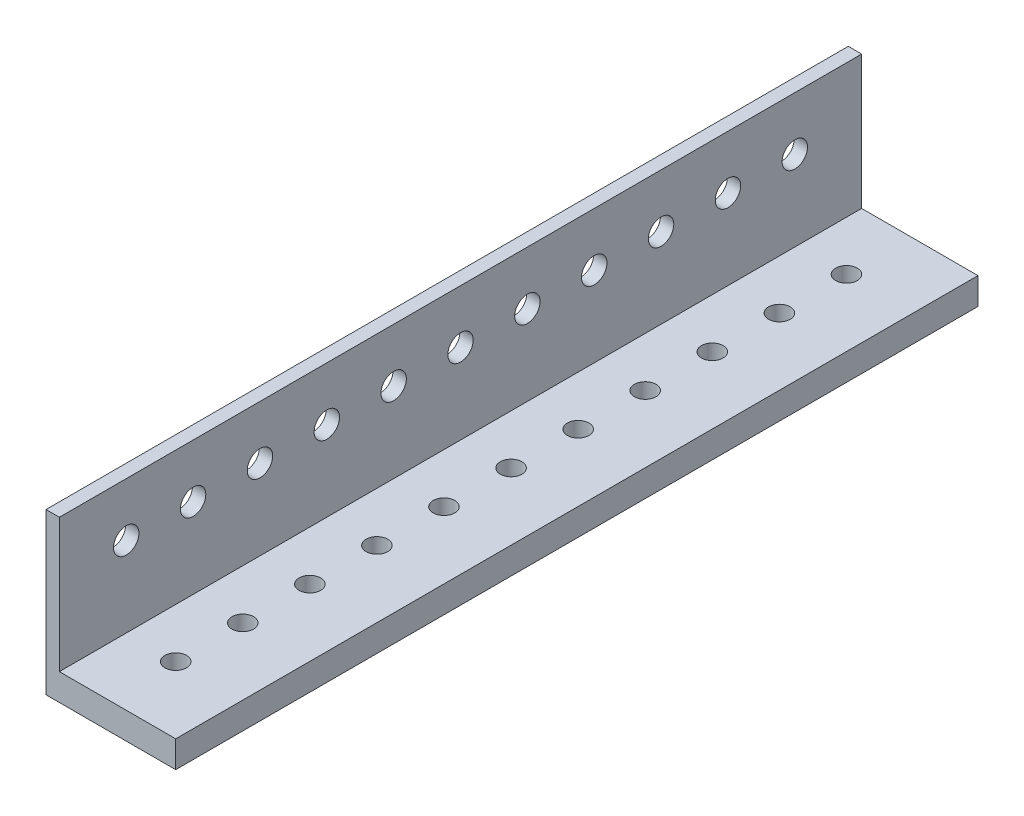
ISO-10303-21;
HEADER;
FILE_DESCRIPTION(('STEP AP214'),'2;1');
FILE_NAME('part.step','',(''),(''),'','','');
FILE_SCHEMA(('AUTOMOTIVE_DESIGN { 1 0 10303 214 1 1 1 1 }'));
ENDSEC;
DATA;
#1=APPLICATION_CONTEXT('core data for automotive mechanical design processes');
#2=APPLICATION_PROTOCOL_DEFINITION('international standard','automotive_design',2000,#1);
#3=PRODUCT_CONTEXT('',#1,'mechanical');
#4=PRODUCT('Part','Part','',(#3));
#5=PRODUCT_RELATED_PRODUCT_CATEGORY('part','',(#4));
#6=PRODUCT_DEFINITION_FORMATION('','',#4);
#7=PRODUCT_DEFINITION_CONTEXT('part definition',#1,'design');
#8=PRODUCT_DEFINITION('design','',#6,#7);
#9=PRODUCT_DEFINITION_SHAPE('','',#8);
#10=(LENGTH_UNIT() NAMED_UNIT(*) SI_UNIT(.MILLI.,.METRE.));
#11=(NAMED_UNIT(*) PLANE_ANGLE_UNIT() SI_UNIT($,.RADIAN.));
#12=(NAMED_UNIT(*) SI_UNIT($,.STERADIAN.) SOLID_ANGLE_UNIT());
#13=UNCERTAINTY_MEASURE_WITH_UNIT(LENGTH_MEASURE(1.E-05),#10,'distance_accuracy_value','');
#14=(GEOMETRIC_REPRESENTATION_CONTEXT(3) GLOBAL_UNCERTAINTY_ASSIGNED_CONTEXT((#13)) GLOBAL_UNIT_ASSIGNED_CONTEXT((#10,
#11,#12)) REPRESENTATION_CONTEXT('',''));
#15=CARTESIAN_POINT('',(0.,0.,0.));
#16=DIRECTION('',(0.,0.,1.));
#17=DIRECTION('',(1.,0.,0.));
#18=AXIS2_PLACEMENT_3D('',#15,#16,#17);
#19=CARTESIAN_POINT('',(2.54,0.,0.));
#20=DIRECTION('',(1.,0.,0.));
#21=DIRECTION('',(0.,0.,-1.));
#22=AXIS2_PLACEMENT_3D('',#19,#20,#21);
#23=PLANE('',#22);
#24=DIRECTION('',(0.,0.,1.));
#25=VECTOR('',#24,1.);
#26=CARTESIAN_POINT('',(2.54,-10.3896808510638,11.2050127762405));
#27=LINE('',#26,#25);
#28=CARTESIAN_POINT('',(2.54,-10.3896808510638,-141.194987223759));
#29=VERTEX_POINT('',#28);
#30=CARTESIAN_POINT('',(2.54,-10.3896808510638,11.2050127762405));
#31=VERTEX_POINT('',#30);
#32=EDGE_CURVE('E54',#29,#31,#27,.T.);
#33=ORIENTED_EDGE('',*,*,#32,.F.);
#34=DIRECTION('',(0.,1.,0.));
#35=VECTOR('',#34,1.);
#36=CARTESIAN_POINT('',(2.54,15.0103191489362,-141.194987223759));
#37=LINE('',#36,#35);
#38=CARTESIAN_POINT('',(2.54,15.0103191489362,-141.194987223759));
#39=VERTEX_POINT('',#38);
#40=EDGE_CURVE('E210',#29,#39,#37,.T.);
#41=ORIENTED_EDGE('',*,*,#40,.T.);
#42=DIRECTION('',(0.,0.,1.));
#43=VECTOR('',#42,1.);
#44=CARTESIAN_POINT('',(2.54,15.0103191489362,11.2050127762406));
#45=LINE('',#44,#43);
#46=CARTESIAN_POINT('',(2.54,15.0103191489362,11.2050127762406));
#47=VERTEX_POINT('',#46);
#48=EDGE_CURVE('E60',#39,#47,#45,.T.);
#49=ORIENTED_EDGE('',*,*,#48,.T.);
#50=DIRECTION('',(0.,-1.,0.));
#51=VECTOR('',#50,1.);
#52=CARTESIAN_POINT('',(2.54,15.0103191489362,11.2050127762406));
#53=LINE('',#52,#51);
#54=EDGE_CURVE('E89',#47,#31,#53,.T.);
#55=ORIENTED_EDGE('',*,*,#54,.T.);
#56=EDGE_LOOP('',(#33,#41,#49,#55));
#57=FACE_BOUND('',#56,.T.);
#58=CARTESIAN_POINT('',(2.54,4.85031914893617,-115.794987223759));
#59=DIRECTION('',(1.,0.,0.));
#60=DIRECTION('',(0.,0.,-1.));
#61=AXIS2_PLACEMENT_3D('',#58,#59,#60);
#62=CIRCLE('',#61,2.41300000000001);
#63=CARTESIAN_POINT('',(2.54,4.85031914893617,-118.207987223759));
#64=VERTEX_POINT('',#63);
#65=EDGE_CURVE('E155',#64,#64,#62,.T.);
#66=ORIENTED_EDGE('',*,*,#65,.F.);
#67=EDGE_LOOP('',(#66));
#68=FACE_BOUND('',#67,.T.);
#69=CARTESIAN_POINT('',(2.54,4.85031914893617,-90.3949872237594));
#70=DIRECTION('',(1.,0.,0.));
#71=DIRECTION('',(0.,0.,-1.));
#72=AXIS2_PLACEMENT_3D('',#69,#70,#71);
#73=CIRCLE('',#72,2.41300000000001);
#74=CARTESIAN_POINT('',(2.54,4.85031914893617,-92.8079872237595));
#75=VERTEX_POINT('',#74);
#76=EDGE_CURVE('E167',#75,#75,#73,.T.);
#77=ORIENTED_EDGE('',*,*,#76,.F.);
#78=EDGE_LOOP('',(#77));
#79=FACE_BOUND('',#78,.T.);
#80=CARTESIAN_POINT('',(2.54,4.85031914893617,-64.9949872237595));
#81=DIRECTION('',(1.,0.,0.));
#82=DIRECTION('',(0.,0.,-1.));
#83=AXIS2_PLACEMENT_3D('',#80,#81,#82);
#84=CIRCLE('',#83,2.41300000000001);
#85=CARTESIAN_POINT('',(2.54,4.85031914893617,-67.4079872237595));
#86=VERTEX_POINT('',#85);
#87=EDGE_CURVE('E179',#86,#86,#84,.T.);
#88=ORIENTED_EDGE('',*,*,#87,.F.);
#89=EDGE_LOOP('',(#88));
#90=FACE_BOUND('',#89,.T.);
#91=CARTESIAN_POINT('',(2.54,4.85031914893617,-39.5949872237594));
#92=DIRECTION('',(1.,0.,0.));
#93=DIRECTION('',(0.,0.,-1.));
#94=AXIS2_PLACEMENT_3D('',#91,#92,#93);
#95=CIRCLE('',#94,2.413);
#96=CARTESIAN_POINT('',(2.54,4.85031914893617,-42.0079872237595));
#97=VERTEX_POINT('',#96);
#98=EDGE_CURVE('E191',#97,#97,#95,.T.);
#99=ORIENTED_EDGE('',*,*,#98,.F.);
#100=EDGE_LOOP('',(#99));
#101=FACE_BOUND('',#100,.T.);
#102=CARTESIAN_POINT('',(2.54,4.85031914893617,-14.1949872237594));
#103=DIRECTION('',(1.,0.,0.));
#104=DIRECTION('',(0.,0.,-1.));
#105=AXIS2_PLACEMENT_3D('',#102,#103,#104);
#106=CIRCLE('',#105,2.413);
#107=CARTESIAN_POINT('',(2.54,4.85031914893617,-16.6079872237594));
#108=VERTEX_POINT('',#107);
#109=EDGE_CURVE('E203',#108,#108,#106,.T.);
#110=ORIENTED_EDGE('',*,*,#109,.F.);
#111=EDGE_LOOP('',(#110));
#112=FACE_BOUND('',#111,.T.);
#113=CARTESIAN_POINT('',(2.54,4.85031914893617,-1.49498722375945));
#114=DIRECTION('',(1.,0.,0.));
#115=DIRECTION('',(0.,0.,-1.));
#116=AXIS2_PLACEMENT_3D('',#113,#114,#115);
#117=CIRCLE('',#116,2.413);
#118=CARTESIAN_POINT('',(2.54,4.85031914893617,-3.90798722375945));
#119=VERTEX_POINT('',#118);
#120=EDGE_CURVE('E101',#119,#119,#117,.T.);
#121=ORIENTED_EDGE('',*,*,#120,.F.);
#122=EDGE_LOOP('',(#121));
#123=FACE_BOUND('',#122,.T.);
#124=CARTESIAN_POINT('',(2.54,4.85031914893617,-26.8949872237594));
#125=DIRECTION('',(1.,0.,0.));
#126=DIRECTION('',(0.,0.,-1.));
#127=AXIS2_PLACEMENT_3D('',#124,#125,#126);
#128=CIRCLE('',#127,2.413);
#129=CARTESIAN_POINT('',(2.54,4.85031914893617,-29.3079872237595));
#130=VERTEX_POINT('',#129);
#131=EDGE_CURVE('E197',#130,#130,#128,.T.);
#132=ORIENTED_EDGE('',*,*,#131,.F.);
#133=EDGE_LOOP('',(#132));
#134=FACE_BOUND('',#133,.T.);
#135=CARTESIAN_POINT('',(2.54,4.85031914893617,-52.2949872237594));
#136=DIRECTION('',(1.,0.,0.));
#137=DIRECTION('',(0.,0.,-1.));
#138=AXIS2_PLACEMENT_3D('',#135,#136,#137);
#139=CIRCLE('',#138,2.413);
#140=CARTESIAN_POINT('',(2.54,4.85031914893617,-54.7079872237595));
#141=VERTEX_POINT('',#140);
#142=EDGE_CURVE('E185',#141,#141,#139,.T.);
#143=ORIENTED_EDGE('',*,*,#142,.F.);
#144=EDGE_LOOP('',(#143));
#145=FACE_BOUND('',#144,.T.);
#146=CARTESIAN_POINT('',(2.54,4.85031914893617,-77.6949872237594));
#147=DIRECTION('',(1.,0.,0.));
#148=DIRECTION('',(0.,0.,-1.));
#149=AXIS2_PLACEMENT_3D('',#146,#147,#148);
#150=CIRCLE('',#149,2.41300000000001);
#151=CARTESIAN_POINT('',(2.54,4.85031914893617,-80.1079872237595));
#152=VERTEX_POINT('',#151);
#153=EDGE_CURVE('E173',#152,#152,#150,.T.);
#154=ORIENTED_EDGE('',*,*,#153,.F.);
#155=EDGE_LOOP('',(#154));
#156=FACE_BOUND('',#155,.T.);
#157=CARTESIAN_POINT('',(2.54,4.85031914893617,-103.094987223759));
#158=DIRECTION('',(1.,0.,0.));
#159=DIRECTION('',(0.,0.,-1.));
#160=AXIS2_PLACEMENT_3D('',#157,#158,#159);
#161=CIRCLE('',#160,2.41300000000001);
#162=CARTESIAN_POINT('',(2.54,4.85031914893617,-105.507987223759));
#163=VERTEX_POINT('',#162);
#164=EDGE_CURVE('E161',#163,#163,#161,.T.);
#165=ORIENTED_EDGE('',*,*,#164,.F.);
#166=EDGE_LOOP('',(#165));
#167=FACE_BOUND('',#166,.T.);
#168=CARTESIAN_POINT('',(2.54,4.85031914893617,-128.494987223759));
#169=DIRECTION('',(1.,0.,0.));
#170=DIRECTION('',(0.,0.,-1.));
#171=AXIS2_PLACEMENT_3D('',#168,#169,#170);
#172=CIRCLE('',#171,2.413);
#173=CARTESIAN_POINT('',(2.54,4.85031914893617,-130.907987223759));
#174=VERTEX_POINT('',#173);
#175=EDGE_CURVE('E149',#174,#174,#172,.T.);
#176=ORIENTED_EDGE('',*,*,#175,.F.);
#177=EDGE_LOOP('',(#176));
#178=FACE_BOUND('',#177,.T.);
#179=ADVANCED_FACE('F39',(#57,#68,#79,#90,#101,#112,#123,#134,#145,#156,#167,#178),#23,.T.);
#180=CARTESIAN_POINT('',(0.,0.,0.));
#181=DIRECTION('',(1.,0.,0.));
#182=DIRECTION('',(0.,0.,-1.));
#183=AXIS2_PLACEMENT_3D('',#180,#181,#182);
#184=PLANE('',#183);
#185=DIRECTION('',(0.,-1.,0.));
#186=VECTOR('',#185,1.);
#187=CARTESIAN_POINT('',(0.,15.0103191489362,11.2050127762406));
#188=LINE('',#187,#186);
#189=CARTESIAN_POINT('',(0.,15.0103191489362,11.2050127762406));
#190=VERTEX_POINT('',#189);
#191=CARTESIAN_POINT('',(0.,-15.4696808510638,11.2050127762405));
#192=VERTEX_POINT('',#191);
#193=EDGE_CURVE('E95',#190,#192,#188,.T.);
#194=ORIENTED_EDGE('',*,*,#193,.F.);
#195=DIRECTION('',(0.,0.,1.));
#196=VECTOR('',#195,1.);
#197=CARTESIAN_POINT('',(0.,15.0103191489362,11.2050127762406));
#198=LINE('',#197,#196);
#199=CARTESIAN_POINT('',(0.,15.0103191489362,-141.194987223759));
#200=VERTEX_POINT('',#199);
#201=EDGE_CURVE('E79',#200,#190,#198,.T.);
#202=ORIENTED_EDGE('',*,*,#201,.F.);
#203=DIRECTION('',(0.,1.,0.));
#204=VECTOR('',#203,1.);
#205=CARTESIAN_POINT('',(0.,15.0103191489362,-141.194987223759));
#206=LINE('',#205,#204);
#207=CARTESIAN_POINT('',(0.,-15.4696808510638,-141.194987223759));
#208=VERTEX_POINT('',#207);
#209=EDGE_CURVE('E90',#208,#200,#206,.T.);
#210=ORIENTED_EDGE('',*,*,#209,.F.);
#211=DIRECTION('',(0.,0.,-1.));
#212=VECTOR('',#211,1.);
#213=CARTESIAN_POINT('',(0.,-15.4696808510638,11.2050127762405));
#214=LINE('',#213,#212);
#215=EDGE_CURVE('E100',#192,#208,#214,.T.);
#216=ORIENTED_EDGE('',*,*,#215,.F.);
#217=EDGE_LOOP('',(#194,#202,#210,#216));
#218=FACE_BOUND('',#217,.T.);
#219=CARTESIAN_POINT('',(0.,4.85031914893617,-1.49498722375945));
#220=DIRECTION('',(1.,0.,0.));
#221=DIRECTION('',(0.,0.,-1.));
#222=AXIS2_PLACEMENT_3D('',#219,#220,#221);
#223=CIRCLE('',#222,2.413);
#224=CARTESIAN_POINT('',(0.,4.85031914893617,-3.90798722375945));
#225=VERTEX_POINT('',#224);
#226=EDGE_CURVE('E105',#225,#225,#223,.T.);
#227=ORIENTED_EDGE('',*,*,#226,.T.);
#228=EDGE_LOOP('',(#227));
#229=FACE_BOUND('',#228,.T.);
#230=CARTESIAN_POINT('',(0.,4.85031914893617,-14.1949872237594));
#231=DIRECTION('',(1.,0.,0.));
#232=DIRECTION('',(0.,0.,-1.));
#233=AXIS2_PLACEMENT_3D('',#230,#231,#232);
#234=CIRCLE('',#233,2.413);
#235=CARTESIAN_POINT('',(0.,4.85031914893617,-16.6079872237594));
#236=VERTEX_POINT('',#235);
#237=EDGE_CURVE('E200',#236,#236,#234,.T.);
#238=ORIENTED_EDGE('',*,*,#237,.T.);
#239=EDGE_LOOP('',(#238));
#240=FACE_BOUND('',#239,.T.);
#241=CARTESIAN_POINT('',(0.,4.85031914893617,-26.8949872237594));
#242=DIRECTION('',(1.,0.,0.));
#243=DIRECTION('',(0.,0.,-1.));
#244=AXIS2_PLACEMENT_3D('',#241,#242,#243);
#245=CIRCLE('',#244,2.413);
#246=CARTESIAN_POINT('',(0.,4.85031914893617,-29.3079872237595));
#247=VERTEX_POINT('',#246);
#248=EDGE_CURVE('E194',#247,#247,#245,.T.);
#249=ORIENTED_EDGE('',*,*,#248,.T.);
#250=EDGE_LOOP('',(#249));
#251=FACE_BOUND('',#250,.T.);
#252=CARTESIAN_POINT('',(0.,4.85031914893617,-39.5949872237594));
#253=DIRECTION('',(1.,0.,0.));
#254=DIRECTION('',(0.,0.,-1.));
#255=AXIS2_PLACEMENT_3D('',#252,#253,#254);
#256=CIRCLE('',#255,2.413);
#257=CARTESIAN_POINT('',(0.,4.85031914893617,-42.0079872237595));
#258=VERTEX_POINT('',#257);
#259=EDGE_CURVE('E188',#258,#258,#256,.T.);
#260=ORIENTED_EDGE('',*,*,#259,.T.);
#261=EDGE_LOOP('',(#260));
#262=FACE_BOUND('',#261,.T.);
#263=CARTESIAN_POINT('',(0.,4.85031914893617,-52.2949872237594));
#264=DIRECTION('',(1.,0.,0.));
#265=DIRECTION('',(0.,0.,-1.));
#266=AXIS2_PLACEMENT_3D('',#263,#264,#265);
#267=CIRCLE('',#266,2.413);
#268=CARTESIAN_POINT('',(0.,4.85031914893617,-54.7079872237595));
#269=VERTEX_POINT('',#268);
#270=EDGE_CURVE('E182',#269,#269,#267,.T.);
#271=ORIENTED_EDGE('',*,*,#270,.T.);
#272=EDGE_LOOP('',(#271));
#273=FACE_BOUND('',#272,.T.);
#274=CARTESIAN_POINT('',(0.,4.85031914893617,-64.9949872237595));
#275=DIRECTION('',(1.,0.,0.));
#276=DIRECTION('',(0.,0.,-1.));
#277=AXIS2_PLACEMENT_3D('',#274,#275,#276);
#278=CIRCLE('',#277,2.41300000000001);
#279=CARTESIAN_POINT('',(0.,4.85031914893617,-67.4079872237595));
#280=VERTEX_POINT('',#279);
#281=EDGE_CURVE('E176',#280,#280,#278,.T.);
#282=ORIENTED_EDGE('',*,*,#281,.T.);
#283=EDGE_LOOP('',(#282));
#284=FACE_BOUND('',#283,.T.);
#285=CARTESIAN_POINT('',(0.,4.85031914893617,-77.6949872237594));
#286=DIRECTION('',(1.,0.,0.));
#287=DIRECTION('',(0.,0.,-1.));
#288=AXIS2_PLACEMENT_3D('',#285,#286,#287);
#289=CIRCLE('',#288,2.41300000000001);
#290=CARTESIAN_POINT('',(0.,4.85031914893617,-80.1079872237595));
#291=VERTEX_POINT('',#290);
#292=EDGE_CURVE('E170',#291,#291,#289,.T.);
#293=ORIENTED_EDGE('',*,*,#292,.T.);
#294=EDGE_LOOP('',(#293));
#295=FACE_BOUND('',#294,.T.);
#296=CARTESIAN_POINT('',(0.,4.85031914893617,-90.3949872237594));
#297=DIRECTION('',(1.,0.,0.));
#298=DIRECTION('',(0.,0.,-1.));
#299=AXIS2_PLACEMENT_3D('',#296,#297,#298);
#300=CIRCLE('',#299,2.41300000000001);
#301=CARTESIAN_POINT('',(0.,4.85031914893617,-92.8079872237595));
#302=VERTEX_POINT('',#301);
#303=EDGE_CURVE('E164',#302,#302,#300,.T.);
#304=ORIENTED_EDGE('',*,*,#303,.T.);
#305=EDGE_LOOP('',(#304));
#306=FACE_BOUND('',#305,.T.);
#307=CARTESIAN_POINT('',(0.,4.85031914893617,-103.094987223759));
#308=DIRECTION('',(1.,0.,0.));
#309=DIRECTION('',(0.,0.,-1.));
#310=AXIS2_PLACEMENT_3D('',#307,#308,#309);
#311=CIRCLE('',#310,2.41300000000001);
#312=CARTESIAN_POINT('',(0.,4.85031914893617,-105.507987223759));
#313=VERTEX_POINT('',#312);
#314=EDGE_CURVE('E158',#313,#313,#311,.T.);
#315=ORIENTED_EDGE('',*,*,#314,.T.);
#316=EDGE_LOOP('',(#315));
#317=FACE_BOUND('',#316,.T.);
#318=CARTESIAN_POINT('',(0.,4.85031914893617,-115.794987223759));
#319=DIRECTION('',(1.,0.,0.));
#320=DIRECTION('',(0.,0.,-1.));
#321=AXIS2_PLACEMENT_3D('',#318,#319,#320);
#322=CIRCLE('',#321,2.41300000000001);
#323=CARTESIAN_POINT('',(0.,4.85031914893617,-118.207987223759));
#324=VERTEX_POINT('',#323);
#325=EDGE_CURVE('E152',#324,#324,#322,.T.);
#326=ORIENTED_EDGE('',*,*,#325,.T.);
#327=EDGE_LOOP('',(#326));
#328=FACE_BOUND('',#327,.T.);
#329=CARTESIAN_POINT('',(0.,4.85031914893617,-128.494987223759));
#330=DIRECTION('',(1.,0.,0.));
#331=DIRECTION('',(0.,0.,-1.));
#332=AXIS2_PLACEMENT_3D('',#329,#330,#331);
#333=CIRCLE('',#332,2.413);
#334=CARTESIAN_POINT('',(0.,4.85031914893617,-130.907987223759));
#335=VERTEX_POINT('',#334);
#336=EDGE_CURVE('E148',#335,#335,#333,.T.);
#337=ORIENTED_EDGE('',*,*,#336,.T.);
#338=EDGE_LOOP('',(#337));
#339=FACE_BOUND('',#338,.T.);
#340=ADVANCED_FACE('F98',(#218,#229,#240,#251,#262,#273,#284,#295,#306,#317,#328,#339),#184,.F.);
#341=CARTESIAN_POINT('',(2.54,15.0103191489362,11.2050127762406));
#342=DIRECTION('',(0.,0.,-1.));
#343=DIRECTION('',(0.,1.,0.));
#344=AXIS2_PLACEMENT_3D('',#341,#342,#343);
#345=PLANE('',#344);
#346=ORIENTED_EDGE('',*,*,#193,.T.);
#347=DIRECTION('',(-1.,0.,0.));
#348=VECTOR('',#347,1.);
#349=CARTESIAN_POINT('',(2.54,-15.4696808510638,11.2050127762405));
#350=LINE('',#349,#348);
#351=CARTESIAN_POINT('',(24.638,-15.4696808510638,11.2050127762405));
#352=VERTEX_POINT('',#351);
#353=EDGE_CURVE('E11',#352,#192,#350,.T.);
#354=ORIENTED_EDGE('',*,*,#353,.F.);
#355=DIRECTION('',(0.,-1.,0.));
#356=VECTOR('',#355,1.);
#357=CARTESIAN_POINT('',(24.638,-15.4696808510638,11.2050127762405));
#358=LINE('',#357,#356);
#359=CARTESIAN_POINT('',(24.638,-10.3896808510638,11.2050127762405));
#360=VERTEX_POINT('',#359);
#361=EDGE_CURVE('E133',#360,#352,#358,.T.);
#362=ORIENTED_EDGE('',*,*,#361,.F.);
#363=DIRECTION('',(-1.,0.,0.));
#364=VECTOR('',#363,1.);
#365=CARTESIAN_POINT('',(24.638,-10.3896808510638,11.2050127762405));
#366=LINE('',#365,#364);
#367=EDGE_CURVE('E141',#360,#31,#366,.T.);
#368=ORIENTED_EDGE('',*,*,#367,.T.);
#369=ORIENTED_EDGE('',*,*,#54,.F.);
#370=DIRECTION('',(-1.,0.,0.));
#371=VECTOR('',#370,1.);
#372=CARTESIAN_POINT('',(2.54,15.0103191489362,11.2050127762406));
#373=LINE('',#372,#371);
#374=EDGE_CURVE('E82',#47,#190,#373,.T.);
#375=ORIENTED_EDGE('',*,*,#374,.T.);
#376=EDGE_LOOP('',(#346,#354,#362,#368,#369,#375));
#377=FACE_BOUND('',#376,.T.);
#378=ADVANCED_FACE('F41',(#377),#345,.F.);
#379=CARTESIAN_POINT('',(2.54,-15.4696808510638,11.2050127762405));
#380=DIRECTION('',(0.,1.,0.));
#381=DIRECTION('',(0.,0.,1.));
#382=AXIS2_PLACEMENT_3D('',#379,#380,#381);
#383=PLANE('',#382);
#384=CARTESIAN_POINT('',(11.938,-15.4696808510638,-1.49498722375945));
#385=DIRECTION('',(0.,1.,0.));
#386=DIRECTION('',(0.,0.,1.));
#387=AXIS2_PLACEMENT_3D('',#384,#385,#386);
#388=CIRCLE('',#387,2.05446934605813);
#389=CARTESIAN_POINT('',(11.938,-15.4696808510638,0.559482122298679));
#390=VERTEX_POINT('',#389);
#391=EDGE_CURVE('E143',#390,#390,#388,.T.);
#392=ORIENTED_EDGE('',*,*,#391,.T.);
#393=EDGE_LOOP('',(#392));
#394=FACE_BOUND('',#393,.T.);
#395=CARTESIAN_POINT('',(11.938,-15.4696808510638,-14.2361292724872));
#396=DIRECTION('',(0.,1.,0.));
#397=DIRECTION('',(0.,0.,1.));
#398=AXIS2_PLACEMENT_3D('',#395,#396,#397);
#399=CIRCLE('',#398,2.05446934605813);
#400=CARTESIAN_POINT('',(11.938,-15.4696808510638,-12.1816599264291));
#401=VERTEX_POINT('',#400);
#402=EDGE_CURVE('E260',#401,#401,#399,.T.);
#403=ORIENTED_EDGE('',*,*,#402,.T.);
#404=EDGE_LOOP('',(#403));
#405=FACE_BOUND('',#404,.T.);
#406=CARTESIAN_POINT('',(11.938,-15.4696808510638,-26.9772713212149));
#407=DIRECTION('',(0.,1.,0.));
#408=DIRECTION('',(0.,0.,1.));
#409=AXIS2_PLACEMENT_3D('',#406,#407,#408);
#410=CIRCLE('',#409,2.05446934605813);
#411=CARTESIAN_POINT('',(11.938,-15.4696808510638,-24.9228019751568));
#412=VERTEX_POINT('',#411);
#413=EDGE_CURVE('E264',#412,#412,#410,.T.);
#414=ORIENTED_EDGE('',*,*,#413,.T.);
#415=EDGE_LOOP('',(#414));
#416=FACE_BOUND('',#415,.T.);
#417=CARTESIAN_POINT('',(11.938,-15.4696808510638,-39.7184133699427));
#418=DIRECTION('',(0.,1.,0.));
#419=DIRECTION('',(0.,0.,1.));
#420=AXIS2_PLACEMENT_3D('',#417,#418,#419);
#421=CIRCLE('',#420,2.05446934605813);
#422=CARTESIAN_POINT('',(11.938,-15.4696808510638,-37.6639440238846));
#423=VERTEX_POINT('',#422);
#424=EDGE_CURVE('E268',#423,#423,#421,.T.);
#425=ORIENTED_EDGE('',*,*,#424,.T.);
#426=EDGE_LOOP('',(#425));
#427=FACE_BOUND('',#426,.T.);
#428=CARTESIAN_POINT('',(11.938,-15.4696808510638,-52.4595554186704));
#429=DIRECTION('',(0.,1.,0.));
#430=DIRECTION('',(0.,0.,1.));
#431=AXIS2_PLACEMENT_3D('',#428,#429,#430);
#432=CIRCLE('',#431,2.05446934605813);
#433=CARTESIAN_POINT('',(11.938,-15.4696808510638,-50.4050860726123));
#434=VERTEX_POINT('',#433);
#435=EDGE_CURVE('E272',#434,#434,#432,.T.);
#436=ORIENTED_EDGE('',*,*,#435,.T.);
#437=EDGE_LOOP('',(#436));
#438=FACE_BOUND('',#437,.T.);
#439=CARTESIAN_POINT('',(11.938,-15.4696808510638,-65.2006974673982));
#440=DIRECTION('',(0.,1.,0.));
#441=DIRECTION('',(0.,0.,1.));
#442=AXIS2_PLACEMENT_3D('',#439,#440,#441);
#443=CIRCLE('',#442,2.05446934605813);
#444=CARTESIAN_POINT('',(11.938,-15.4696808510638,-63.14622812134));
#445=VERTEX_POINT('',#444);
#446=EDGE_CURVE('E276',#445,#445,#443,.T.);
#447=ORIENTED_EDGE('',*,*,#446,.T.);
#448=EDGE_LOOP('',(#447));
#449=FACE_BOUND('',#448,.T.);
#450=CARTESIAN_POINT('',(11.938,-15.4696808510638,-77.9418395161259));
#451=DIRECTION('',(0.,1.,0.));
#452=DIRECTION('',(0.,0.,1.));
#453=AXIS2_PLACEMENT_3D('',#450,#451,#452);
#454=CIRCLE('',#453,2.05446934605813);
#455=CARTESIAN_POINT('',(11.938,-15.4696808510638,-75.8873701700678));
#456=VERTEX_POINT('',#455);
#457=EDGE_CURVE('E280',#456,#456,#454,.T.);
#458=ORIENTED_EDGE('',*,*,#457,.T.);
#459=EDGE_LOOP('',(#458));
#460=FACE_BOUND('',#459,.T.);
#461=CARTESIAN_POINT('',(11.938,-15.4696808510638,-90.6829815648537));
#462=DIRECTION('',(0.,1.,0.));
#463=DIRECTION('',(0.,0.,1.));
#464=AXIS2_PLACEMENT_3D('',#461,#462,#463);
#465=CIRCLE('',#464,2.05446934605813);
#466=CARTESIAN_POINT('',(11.938,-15.4696808510638,-88.6285122187955));
#467=VERTEX_POINT('',#466);
#468=EDGE_CURVE('E284',#467,#467,#465,.T.);
#469=ORIENTED_EDGE('',*,*,#468,.T.);
#470=EDGE_LOOP('',(#469));
#471=FACE_BOUND('',#470,.T.);
#472=CARTESIAN_POINT('',(11.938,-15.4696808510638,-103.424123613581));
#473=DIRECTION('',(0.,1.,0.));
#474=DIRECTION('',(0.,0.,1.));
#475=AXIS2_PLACEMENT_3D('',#472,#473,#474);
#476=CIRCLE('',#475,2.05446934605813);
#477=CARTESIAN_POINT('',(11.938,-15.4696808510638,-101.369654267523));
#478=VERTEX_POINT('',#477);
#479=EDGE_CURVE('E288',#478,#478,#476,.T.);
#480=ORIENTED_EDGE('',*,*,#479,.T.);
#481=EDGE_LOOP('',(#480));
#482=FACE_BOUND('',#481,.T.);
#483=CARTESIAN_POINT('',(11.938,-15.4696808510638,-116.165265662309));
#484=DIRECTION('',(0.,1.,0.));
#485=DIRECTION('',(0.,0.,1.));
#486=AXIS2_PLACEMENT_3D('',#483,#484,#485);
#487=CIRCLE('',#486,2.05446934605813);
#488=CARTESIAN_POINT('',(11.938,-15.4696808510638,-114.110796316251));
#489=VERTEX_POINT('',#488);
#490=EDGE_CURVE('E292',#489,#489,#487,.T.);
#491=ORIENTED_EDGE('',*,*,#490,.T.);
#492=EDGE_LOOP('',(#491));
#493=FACE_BOUND('',#492,.T.);
#494=CARTESIAN_POINT('',(11.938,-15.4696808510638,-128.906407711037));
#495=DIRECTION('',(0.,1.,0.));
#496=DIRECTION('',(0.,0.,1.));
#497=AXIS2_PLACEMENT_3D('',#494,#495,#496);
#498=CIRCLE('',#497,2.05446934605813);
#499=CARTESIAN_POINT('',(11.938,-15.4696808510638,-126.851938364979));
#500=VERTEX_POINT('',#499);
#501=EDGE_CURVE('E295',#500,#500,#498,.T.);
#502=ORIENTED_EDGE('',*,*,#501,.T.);
#503=EDGE_LOOP('',(#502));
#504=FACE_BOUND('',#503,.T.);
#505=ORIENTED_EDGE('',*,*,#215,.T.);
#506=DIRECTION('',(-1.,0.,0.));
#507=VECTOR('',#506,1.);
#508=CARTESIAN_POINT('',(2.54,-15.4696808510638,-141.194987223759));
#509=LINE('',#508,#507);
#510=CARTESIAN_POINT('',(24.638,-15.4696808510638,-141.194987223759));
#511=VERTEX_POINT('',#510);
#512=EDGE_CURVE('E47',#511,#208,#509,.T.);
#513=ORIENTED_EDGE('',*,*,#512,.F.);
#514=DIRECTION('',(0.,0.,-1.));
#515=VECTOR('',#514,1.);
#516=CARTESIAN_POINT('',(24.638,-15.4696808510638,11.2050127762405));
#517=LINE('',#516,#515);
#518=EDGE_CURVE('E125',#352,#511,#517,.T.);
#519=ORIENTED_EDGE('',*,*,#518,.F.);
#520=ORIENTED_EDGE('',*,*,#353,.T.);
#521=EDGE_LOOP('',(#505,#513,#519,#520));
#522=FACE_BOUND('',#521,.T.);
#523=ADVANCED_FACE('F123',(#394,#405,#416,#427,#438,#449,#460,#471,#482,#493,#504,#522),#383,.F.);
#524=CARTESIAN_POINT('',(2.54,15.0103191489362,-141.194987223759));
#525=DIRECTION('',(0.,0.,1.));
#526=DIRECTION('',(1.,0.,0.));
#527=AXIS2_PLACEMENT_3D('',#524,#525,#526);
#528=PLANE('',#527);
#529=ORIENTED_EDGE('',*,*,#209,.T.);
#530=DIRECTION('',(-1.,0.,0.));
#531=VECTOR('',#530,1.);
#532=CARTESIAN_POINT('',(2.54,15.0103191489362,-141.194987223759));
#533=LINE('',#532,#531);
#534=EDGE_CURVE('E85',#39,#200,#533,.T.);
#535=ORIENTED_EDGE('',*,*,#534,.F.);
#536=ORIENTED_EDGE('',*,*,#40,.F.);
#537=DIRECTION('',(-1.,0.,0.));
#538=VECTOR('',#537,1.);
#539=CARTESIAN_POINT('',(24.638,-10.3896808510638,-141.194987223759));
#540=LINE('',#539,#538);
#541=CARTESIAN_POINT('',(24.638,-10.3896808510638,-141.194987223759));
#542=VERTEX_POINT('',#541);
#543=EDGE_CURVE('E145',#542,#29,#540,.T.);
#544=ORIENTED_EDGE('',*,*,#543,.F.);
#545=DIRECTION('',(0.,1.,0.));
#546=VECTOR('',#545,1.);
#547=CARTESIAN_POINT('',(24.638,-15.4696808510638,-141.194987223759));
#548=LINE('',#547,#546);
#549=EDGE_CURVE('E119',#511,#542,#548,.T.);
#550=ORIENTED_EDGE('',*,*,#549,.F.);
#551=ORIENTED_EDGE('',*,*,#512,.T.);
#552=EDGE_LOOP('',(#529,#535,#536,#544,#550,#551));
#553=FACE_BOUND('',#552,.T.);
#554=ADVANCED_FACE('F115',(#553),#528,.F.);
#555=CARTESIAN_POINT('',(2.54,15.0103191489362,11.2050127762406));
#556=DIRECTION('',(0.,-1.,0.));
#557=DIRECTION('',(0.,0.,-1.));
#558=AXIS2_PLACEMENT_3D('',#555,#556,#557);
#559=PLANE('',#558);
#560=ORIENTED_EDGE('',*,*,#201,.T.);
#561=ORIENTED_EDGE('',*,*,#374,.F.);
#562=ORIENTED_EDGE('',*,*,#48,.F.);
#563=ORIENTED_EDGE('',*,*,#534,.T.);
#564=EDGE_LOOP('',(#560,#561,#562,#563));
#565=FACE_BOUND('',#564,.T.);
#566=ADVANCED_FACE('F81',(#565),#559,.F.);
#567=CARTESIAN_POINT('',(2.54,4.85031914893617,-1.49498722375945));
#568=DIRECTION('',(-1.,0.,0.));
#569=DIRECTION('',(0.,0.,1.));
#570=AXIS2_PLACEMENT_3D('',#567,#568,#569);
#571=CYLINDRICAL_SURFACE('',#570,2.413);
#572=ORIENTED_EDGE('',*,*,#120,.T.);
#573=EDGE_LOOP('',(#572));
#574=FACE_BOUND('',#573,.T.);
#575=ORIENTED_EDGE('',*,*,#226,.F.);
#576=EDGE_LOOP('',(#575));
#577=FACE_BOUND('',#576,.T.);
#578=ADVANCED_FACE('F245',(#574,#577),#571,.F.);
#579=CARTESIAN_POINT('',(2.54,4.85031914893617,-14.1949872237594));
#580=DIRECTION('',(-1.,0.,0.));
#581=DIRECTION('',(0.,0.,1.));
#582=AXIS2_PLACEMENT_3D('',#579,#580,#581);
#583=CYLINDRICAL_SURFACE('',#582,2.413);
#584=ORIENTED_EDGE('',*,*,#109,.T.);
#585=EDGE_LOOP('',(#584));
#586=FACE_BOUND('',#585,.T.);
#587=ORIENTED_EDGE('',*,*,#237,.F.);
#588=EDGE_LOOP('',(#587));
#589=FACE_BOUND('',#588,.T.);
#590=ADVANCED_FACE('F535',(#586,#589),#583,.F.);
#591=CARTESIAN_POINT('',(2.54,4.85031914893617,-26.8949872237594));
#592=DIRECTION('',(-1.,0.,0.));
#593=DIRECTION('',(0.,0.,1.));
#594=AXIS2_PLACEMENT_3D('',#591,#592,#593);
#595=CYLINDRICAL_SURFACE('',#594,2.413);
#596=ORIENTED_EDGE('',*,*,#131,.T.);
#597=EDGE_LOOP('',(#596));
#598=FACE_BOUND('',#597,.T.);
#599=ORIENTED_EDGE('',*,*,#248,.F.);
#600=EDGE_LOOP('',(#599));
#601=FACE_BOUND('',#600,.T.);
#602=ADVANCED_FACE('F526',(#598,#601),#595,.F.);
#603=CARTESIAN_POINT('',(2.54,4.85031914893617,-39.5949872237594));
#604=DIRECTION('',(-1.,0.,0.));
#605=DIRECTION('',(0.,0.,1.));
#606=AXIS2_PLACEMENT_3D('',#603,#604,#605);
#607=CYLINDRICAL_SURFACE('',#606,2.413);
#608=ORIENTED_EDGE('',*,*,#98,.T.);
#609=EDGE_LOOP('',(#608));
#610=FACE_BOUND('',#609,.T.);
#611=ORIENTED_EDGE('',*,*,#259,.F.);
#612=EDGE_LOOP('',(#611));
#613=FACE_BOUND('',#612,.T.);
#614=ADVANCED_FACE('F517',(#610,#613),#607,.F.);
#615=CARTESIAN_POINT('',(2.54,4.85031914893617,-52.2949872237594));
#616=DIRECTION('',(-1.,0.,0.));
#617=DIRECTION('',(0.,0.,1.));
#618=AXIS2_PLACEMENT_3D('',#615,#616,#617);
#619=CYLINDRICAL_SURFACE('',#618,2.413);
#620=ORIENTED_EDGE('',*,*,#142,.T.);
#621=EDGE_LOOP('',(#620));
#622=FACE_BOUND('',#621,.T.);
#623=ORIENTED_EDGE('',*,*,#270,.F.);
#624=EDGE_LOOP('',(#623));
#625=FACE_BOUND('',#624,.T.);
#626=ADVANCED_FACE('F508',(#622,#625),#619,.F.);
#627=CARTESIAN_POINT('',(2.54,4.85031914893617,-64.9949872237595));
#628=DIRECTION('',(-1.,0.,0.));
#629=DIRECTION('',(0.,0.,1.));
#630=AXIS2_PLACEMENT_3D('',#627,#628,#629);
#631=CYLINDRICAL_SURFACE('',#630,2.41300000000001);
#632=ORIENTED_EDGE('',*,*,#87,.T.);
#633=EDGE_LOOP('',(#632));
#634=FACE_BOUND('',#633,.T.);
#635=ORIENTED_EDGE('',*,*,#281,.F.);
#636=EDGE_LOOP('',(#635));
#637=FACE_BOUND('',#636,.T.);
#638=ADVANCED_FACE('F499',(#634,#637),#631,.F.);
#639=CARTESIAN_POINT('',(2.54,4.85031914893617,-77.6949872237594));
#640=DIRECTION('',(-1.,0.,0.));
#641=DIRECTION('',(0.,0.,1.));
#642=AXIS2_PLACEMENT_3D('',#639,#640,#641);
#643=CYLINDRICAL_SURFACE('',#642,2.41300000000001);
#644=ORIENTED_EDGE('',*,*,#153,.T.);
#645=EDGE_LOOP('',(#644));
#646=FACE_BOUND('',#645,.T.);
#647=ORIENTED_EDGE('',*,*,#292,.F.);
#648=EDGE_LOOP('',(#647));
#649=FACE_BOUND('',#648,.T.);
#650=ADVANCED_FACE('F490',(#646,#649),#643,.F.);
#651=CARTESIAN_POINT('',(2.54,4.85031914893617,-90.3949872237594));
#652=DIRECTION('',(-1.,0.,0.));
#653=DIRECTION('',(0.,0.,1.));
#654=AXIS2_PLACEMENT_3D('',#651,#652,#653);
#655=CYLINDRICAL_SURFACE('',#654,2.41300000000001);
#656=ORIENTED_EDGE('',*,*,#76,.T.);
#657=EDGE_LOOP('',(#656));
#658=FACE_BOUND('',#657,.T.);
#659=ORIENTED_EDGE('',*,*,#303,.F.);
#660=EDGE_LOOP('',(#659));
#661=FACE_BOUND('',#660,.T.);
#662=ADVANCED_FACE('F481',(#658,#661),#655,.F.);
#663=CARTESIAN_POINT('',(2.54,4.85031914893617,-103.094987223759));
#664=DIRECTION('',(-1.,0.,0.));
#665=DIRECTION('',(0.,0.,1.));
#666=AXIS2_PLACEMENT_3D('',#663,#664,#665);
#667=CYLINDRICAL_SURFACE('',#666,2.41300000000001);
#668=ORIENTED_EDGE('',*,*,#164,.T.);
#669=EDGE_LOOP('',(#668));
#670=FACE_BOUND('',#669,.T.);
#671=ORIENTED_EDGE('',*,*,#314,.F.);
#672=EDGE_LOOP('',(#671));
#673=FACE_BOUND('',#672,.T.);
#674=ADVANCED_FACE('F472',(#670,#673),#667,.F.);
#675=CARTESIAN_POINT('',(2.54,4.85031914893617,-115.794987223759));
#676=DIRECTION('',(-1.,0.,0.));
#677=DIRECTION('',(0.,0.,1.));
#678=AXIS2_PLACEMENT_3D('',#675,#676,#677);
#679=CYLINDRICAL_SURFACE('',#678,2.41300000000001);
#680=ORIENTED_EDGE('',*,*,#65,.T.);
#681=EDGE_LOOP('',(#680));
#682=FACE_BOUND('',#681,.T.);
#683=ORIENTED_EDGE('',*,*,#325,.F.);
#684=EDGE_LOOP('',(#683));
#685=FACE_BOUND('',#684,.T.);
#686=ADVANCED_FACE('F232',(#682,#685),#679,.F.);
#687=CARTESIAN_POINT('',(2.54,4.85031914893617,-128.494987223759));
#688=DIRECTION('',(-1.,0.,0.));
#689=DIRECTION('',(0.,0.,1.));
#690=AXIS2_PLACEMENT_3D('',#687,#688,#689);
#691=CYLINDRICAL_SURFACE('',#690,2.413);
#692=ORIENTED_EDGE('',*,*,#175,.T.);
#693=EDGE_LOOP('',(#692));
#694=FACE_BOUND('',#693,.T.);
#695=ORIENTED_EDGE('',*,*,#336,.F.);
#696=EDGE_LOOP('',(#695));
#697=FACE_BOUND('',#696,.T.);
#698=ADVANCED_FACE('F221',(#694,#697),#691,.F.);
#699=CARTESIAN_POINT('',(24.638,-10.3896808510638,11.2050127762405));
#700=DIRECTION('',(0.,-1.,0.));
#701=DIRECTION('',(0.,0.,-1.));
#702=AXIS2_PLACEMENT_3D('',#699,#700,#701);
#703=PLANE('',#702);
#704=CARTESIAN_POINT('',(11.938,-10.3896808510638,-1.49498722375945));
#705=DIRECTION('',(0.,1.,0.));
#706=DIRECTION('',(0.,0.,1.));
#707=AXIS2_PLACEMENT_3D('',#704,#705,#706);
#708=CIRCLE('',#707,2.05446934605813);
#709=CARTESIAN_POINT('',(11.938,-10.3896808510638,0.559482122298679));
#710=VERTEX_POINT('',#709);
#711=EDGE_CURVE('E337',#710,#710,#708,.T.);
#712=ORIENTED_EDGE('',*,*,#711,.F.);
#713=EDGE_LOOP('',(#712));
#714=FACE_BOUND('',#713,.T.);
#715=CARTESIAN_POINT('',(11.938,-10.3896808510638,-14.2361292724872));
#716=DIRECTION('',(0.,1.,0.));
#717=DIRECTION('',(0.,0.,1.));
#718=AXIS2_PLACEMENT_3D('',#715,#716,#717);
#719=CIRCLE('',#718,2.05446934605813);
#720=CARTESIAN_POINT('',(11.938,-10.3896808510638,-12.1816599264291));
#721=VERTEX_POINT('',#720);
#722=EDGE_CURVE('E334',#721,#721,#719,.T.);
#723=ORIENTED_EDGE('',*,*,#722,.F.);
#724=EDGE_LOOP('',(#723));
#725=FACE_BOUND('',#724,.T.);
#726=CARTESIAN_POINT('',(11.938,-10.3896808510638,-26.9772713212149));
#727=DIRECTION('',(0.,1.,0.));
#728=DIRECTION('',(0.,0.,1.));
#729=AXIS2_PLACEMENT_3D('',#726,#727,#728);
#730=CIRCLE('',#729,2.05446934605813);
#731=CARTESIAN_POINT('',(11.938,-10.3896808510638,-24.9228019751568));
#732=VERTEX_POINT('',#731);
#733=EDGE_CURVE('E330',#732,#732,#730,.T.);
#734=ORIENTED_EDGE('',*,*,#733,.F.);
#735=EDGE_LOOP('',(#734));
#736=FACE_BOUND('',#735,.T.);
#737=CARTESIAN_POINT('',(11.938,-10.3896808510638,-39.7184133699427));
#738=DIRECTION('',(0.,1.,0.));
#739=DIRECTION('',(0.,0.,1.));
#740=AXIS2_PLACEMENT_3D('',#737,#738,#739);
#741=CIRCLE('',#740,2.05446934605813);
#742=CARTESIAN_POINT('',(11.938,-10.3896808510638,-37.6639440238846));
#743=VERTEX_POINT('',#742);
#744=EDGE_CURVE('E326',#743,#743,#741,.T.);
#745=ORIENTED_EDGE('',*,*,#744,.F.);
#746=EDGE_LOOP('',(#745));
#747=FACE_BOUND('',#746,.T.);
#748=CARTESIAN_POINT('',(11.938,-10.3896808510638,-52.4595554186704));
#749=DIRECTION('',(0.,1.,0.));
#750=DIRECTION('',(0.,0.,1.));
#751=AXIS2_PLACEMENT_3D('',#748,#749,#750);
#752=CIRCLE('',#751,2.05446934605813);
#753=CARTESIAN_POINT('',(11.938,-10.3896808510638,-50.4050860726123));
#754=VERTEX_POINT('',#753);
#755=EDGE_CURVE('E322',#754,#754,#752,.T.);
#756=ORIENTED_EDGE('',*,*,#755,.F.);
#757=EDGE_LOOP('',(#756));
#758=FACE_BOUND('',#757,.T.);
#759=CARTESIAN_POINT('',(11.938,-10.3896808510638,-65.2006974673982));
#760=DIRECTION('',(0.,1.,0.));
#761=DIRECTION('',(0.,0.,1.));
#762=AXIS2_PLACEMENT_3D('',#759,#760,#761);
#763=CIRCLE('',#762,2.05446934605813);
#764=CARTESIAN_POINT('',(11.938,-10.3896808510638,-63.14622812134));
#765=VERTEX_POINT('',#764);
#766=EDGE_CURVE('E318',#765,#765,#763,.T.);
#767=ORIENTED_EDGE('',*,*,#766,.F.);
#768=EDGE_LOOP('',(#767));
#769=FACE_BOUND('',#768,.T.);
#770=CARTESIAN_POINT('',(11.938,-10.3896808510638,-77.9418395161259));
#771=DIRECTION('',(0.,1.,0.));
#772=DIRECTION('',(0.,0.,1.));
#773=AXIS2_PLACEMENT_3D('',#770,#771,#772);
#774=CIRCLE('',#773,2.05446934605813);
#775=CARTESIAN_POINT('',(11.938,-10.3896808510638,-75.8873701700678));
#776=VERTEX_POINT('',#775);
#777=EDGE_CURVE('E314',#776,#776,#774,.T.);
#778=ORIENTED_EDGE('',*,*,#777,.F.);
#779=EDGE_LOOP('',(#778));
#780=FACE_BOUND('',#779,.T.);
#781=CARTESIAN_POINT('',(11.938,-10.3896808510638,-90.6829815648537));
#782=DIRECTION('',(0.,1.,0.));
#783=DIRECTION('',(0.,0.,1.));
#784=AXIS2_PLACEMENT_3D('',#781,#782,#783);
#785=CIRCLE('',#784,2.05446934605813);
#786=CARTESIAN_POINT('',(11.938,-10.3896808510638,-88.6285122187955));
#787=VERTEX_POINT('',#786);
#788=EDGE_CURVE('E310',#787,#787,#785,.T.);
#789=ORIENTED_EDGE('',*,*,#788,.F.);
#790=EDGE_LOOP('',(#789));
#791=FACE_BOUND('',#790,.T.);
#792=CARTESIAN_POINT('',(11.938,-10.3896808510638,-103.424123613581));
#793=DIRECTION('',(0.,1.,0.));
#794=DIRECTION('',(0.,0.,1.));
#795=AXIS2_PLACEMENT_3D('',#792,#793,#794);
#796=CIRCLE('',#795,2.05446934605813);
#797=CARTESIAN_POINT('',(11.938,-10.3896808510638,-101.369654267523));
#798=VERTEX_POINT('',#797);
#799=EDGE_CURVE('E306',#798,#798,#796,.T.);
#800=ORIENTED_EDGE('',*,*,#799,.F.);
#801=EDGE_LOOP('',(#800));
#802=FACE_BOUND('',#801,.T.);
#803=CARTESIAN_POINT('',(11.938,-10.3896808510638,-116.165265662309));
#804=DIRECTION('',(0.,1.,0.));
#805=DIRECTION('',(0.,0.,1.));
#806=AXIS2_PLACEMENT_3D('',#803,#804,#805);
#807=CIRCLE('',#806,2.05446934605813);
#808=CARTESIAN_POINT('',(11.938,-10.3896808510638,-114.110796316251));
#809=VERTEX_POINT('',#808);
#810=EDGE_CURVE('E302',#809,#809,#807,.T.);
#811=ORIENTED_EDGE('',*,*,#810,.F.);
#812=EDGE_LOOP('',(#811));
#813=FACE_BOUND('',#812,.T.);
#814=CARTESIAN_POINT('',(11.938,-10.3896808510638,-128.906407711037));
#815=DIRECTION('',(0.,1.,0.));
#816=DIRECTION('',(0.,0.,1.));
#817=AXIS2_PLACEMENT_3D('',#814,#815,#816);
#818=CIRCLE('',#817,2.05446934605813);
#819=CARTESIAN_POINT('',(11.938,-10.3896808510638,-126.851938364979));
#820=VERTEX_POINT('',#819);
#821=EDGE_CURVE('E297',#820,#820,#818,.T.);
#822=ORIENTED_EDGE('',*,*,#821,.F.);
#823=EDGE_LOOP('',(#822));
#824=FACE_BOUND('',#823,.T.);
#825=ORIENTED_EDGE('',*,*,#32,.T.);
#826=ORIENTED_EDGE('',*,*,#367,.F.);
#827=DIRECTION('',(0.,0.,1.));
#828=VECTOR('',#827,1.);
#829=CARTESIAN_POINT('',(24.638,-10.3896808510638,11.2050127762405));
#830=LINE('',#829,#828);
#831=EDGE_CURVE('E135',#542,#360,#830,.T.);
#832=ORIENTED_EDGE('',*,*,#831,.F.);
#833=ORIENTED_EDGE('',*,*,#543,.T.);
#834=EDGE_LOOP('',(#825,#826,#832,#833));
#835=FACE_BOUND('',#834,.T.);
#836=ADVANCED_FACE('F214',(#714,#725,#736,#747,#758,#769,#780,#791,#802,#813,#824,#835),#703,.F.);
#837=CARTESIAN_POINT('',(24.638,0.,0.));
#838=DIRECTION('',(-1.,0.,0.));
#839=DIRECTION('',(0.,0.,1.));
#840=AXIS2_PLACEMENT_3D('',#837,#838,#839);
#841=PLANE('',#840);
#842=ORIENTED_EDGE('',*,*,#361,.T.);
#843=ORIENTED_EDGE('',*,*,#518,.T.);
#844=ORIENTED_EDGE('',*,*,#549,.T.);
#845=ORIENTED_EDGE('',*,*,#831,.T.);
#846=EDGE_LOOP('',(#842,#843,#844,#845));
#847=FACE_BOUND('',#846,.T.);
#848=ADVANCED_FACE('F130',(#847),#841,.F.);
#849=CARTESIAN_POINT('',(11.938,-15.4696808510638,-128.906407711037));
#850=DIRECTION('',(0.,1.,0.));
#851=DIRECTION('',(0.,0.,1.));
#852=AXIS2_PLACEMENT_3D('',#849,#850,#851);
#853=CYLINDRICAL_SURFACE('',#852,2.05446934605813);
#854=ORIENTED_EDGE('',*,*,#501,.F.);
#855=EDGE_LOOP('',(#854));
#856=FACE_BOUND('',#855,.T.);
#857=ORIENTED_EDGE('',*,*,#821,.T.);
#858=EDGE_LOOP('',(#857));
#859=FACE_BOUND('',#858,.T.);
#860=ADVANCED_FACE('F229',(#856,#859),#853,.F.);
#861=CARTESIAN_POINT('',(11.938,-15.4696808510638,-116.165265662309));
#862=DIRECTION('',(0.,1.,0.));
#863=DIRECTION('',(0.,0.,1.));
#864=AXIS2_PLACEMENT_3D('',#861,#862,#863);
#865=CYLINDRICAL_SURFACE('',#864,2.05446934605813);
#866=ORIENTED_EDGE('',*,*,#490,.F.);
#867=EDGE_LOOP('',(#866));
#868=FACE_BOUND('',#867,.T.);
#869=ORIENTED_EDGE('',*,*,#810,.T.);
#870=EDGE_LOOP('',(#869));
#871=FACE_BOUND('',#870,.T.);
#872=ADVANCED_FACE('F379',(#868,#871),#865,.F.);
#873=CARTESIAN_POINT('',(11.938,-15.4696808510638,-103.424123613581));
#874=DIRECTION('',(0.,1.,0.));
#875=DIRECTION('',(0.,0.,1.));
#876=AXIS2_PLACEMENT_3D('',#873,#874,#875);
#877=CYLINDRICAL_SURFACE('',#876,2.05446934605813);
#878=ORIENTED_EDGE('',*,*,#479,.F.);
#879=EDGE_LOOP('',(#878));
#880=FACE_BOUND('',#879,.T.);
#881=ORIENTED_EDGE('',*,*,#799,.T.);
#882=EDGE_LOOP('',(#881));
#883=FACE_BOUND('',#882,.T.);
#884=ADVANCED_FACE('F375',(#880,#883),#877,.F.);
#885=CARTESIAN_POINT('',(11.938,-15.4696808510638,-90.6829815648537));
#886=DIRECTION('',(0.,1.,0.));
#887=DIRECTION('',(0.,0.,1.));
#888=AXIS2_PLACEMENT_3D('',#885,#886,#887);
#889=CYLINDRICAL_SURFACE('',#888,2.05446934605813);
#890=ORIENTED_EDGE('',*,*,#468,.F.);
#891=EDGE_LOOP('',(#890));
#892=FACE_BOUND('',#891,.T.);
#893=ORIENTED_EDGE('',*,*,#788,.T.);
#894=EDGE_LOOP('',(#893));
#895=FACE_BOUND('',#894,.T.);
#896=ADVANCED_FACE('F371',(#892,#895),#889,.F.);
#897=CARTESIAN_POINT('',(11.938,-15.4696808510638,-77.9418395161259));
#898=DIRECTION('',(0.,1.,0.));
#899=DIRECTION('',(0.,0.,1.));
#900=AXIS2_PLACEMENT_3D('',#897,#898,#899);
#901=CYLINDRICAL_SURFACE('',#900,2.05446934605813);
#902=ORIENTED_EDGE('',*,*,#457,.F.);
#903=EDGE_LOOP('',(#902));
#904=FACE_BOUND('',#903,.T.);
#905=ORIENTED_EDGE('',*,*,#777,.T.);
#906=EDGE_LOOP('',(#905));
#907=FACE_BOUND('',#906,.T.);
#908=ADVANCED_FACE('F367',(#904,#907),#901,.F.);
#909=CARTESIAN_POINT('',(11.938,-15.4696808510638,-65.2006974673982));
#910=DIRECTION('',(0.,1.,0.));
#911=DIRECTION('',(0.,0.,1.));
#912=AXIS2_PLACEMENT_3D('',#909,#910,#911);
#913=CYLINDRICAL_SURFACE('',#912,2.05446934605813);
#914=ORIENTED_EDGE('',*,*,#446,.F.);
#915=EDGE_LOOP('',(#914));
#916=FACE_BOUND('',#915,.T.);
#917=ORIENTED_EDGE('',*,*,#766,.T.);
#918=EDGE_LOOP('',(#917));
#919=FACE_BOUND('',#918,.T.);
#920=ADVANCED_FACE('F363',(#916,#919),#913,.F.);
#921=CARTESIAN_POINT('',(11.938,-15.4696808510638,-52.4595554186704));
#922=DIRECTION('',(0.,1.,0.));
#923=DIRECTION('',(0.,0.,1.));
#924=AXIS2_PLACEMENT_3D('',#921,#922,#923);
#925=CYLINDRICAL_SURFACE('',#924,2.05446934605813);
#926=ORIENTED_EDGE('',*,*,#435,.F.);
#927=EDGE_LOOP('',(#926));
#928=FACE_BOUND('',#927,.T.);
#929=ORIENTED_EDGE('',*,*,#755,.T.);
#930=EDGE_LOOP('',(#929));
#931=FACE_BOUND('',#930,.T.);
#932=ADVANCED_FACE('F359',(#928,#931),#925,.F.);
#933=CARTESIAN_POINT('',(11.938,-15.4696808510638,-39.7184133699427));
#934=DIRECTION('',(0.,1.,0.));
#935=DIRECTION('',(0.,0.,1.));
#936=AXIS2_PLACEMENT_3D('',#933,#934,#935);
#937=CYLINDRICAL_SURFACE('',#936,2.05446934605813);
#938=ORIENTED_EDGE('',*,*,#424,.F.);
#939=EDGE_LOOP('',(#938));
#940=FACE_BOUND('',#939,.T.);
#941=ORIENTED_EDGE('',*,*,#744,.T.);
#942=EDGE_LOOP('',(#941));
#943=FACE_BOUND('',#942,.T.);
#944=ADVANCED_FACE('F355',(#940,#943),#937,.F.);
#945=CARTESIAN_POINT('',(11.938,-15.4696808510638,-26.9772713212149));
#946=DIRECTION('',(0.,1.,0.));
#947=DIRECTION('',(0.,0.,1.));
#948=AXIS2_PLACEMENT_3D('',#945,#946,#947);
#949=CYLINDRICAL_SURFACE('',#948,2.05446934605813);
#950=ORIENTED_EDGE('',*,*,#413,.F.);
#951=EDGE_LOOP('',(#950));
#952=FACE_BOUND('',#951,.T.);
#953=ORIENTED_EDGE('',*,*,#733,.T.);
#954=EDGE_LOOP('',(#953));
#955=FACE_BOUND('',#954,.T.);
#956=ADVANCED_FACE('F349',(#952,#955),#949,.F.);
#957=CARTESIAN_POINT('',(11.938,-15.4696808510638,-14.2361292724872));
#958=DIRECTION('',(0.,1.,0.));
#959=DIRECTION('',(0.,0.,1.));
#960=AXIS2_PLACEMENT_3D('',#957,#958,#959);
#961=CYLINDRICAL_SURFACE('',#960,2.05446934605813);
#962=ORIENTED_EDGE('',*,*,#402,.F.);
#963=EDGE_LOOP('',(#962));
#964=FACE_BOUND('',#963,.T.);
#965=ORIENTED_EDGE('',*,*,#722,.T.);
#966=EDGE_LOOP('',(#965));
#967=FACE_BOUND('',#966,.T.);
#968=ADVANCED_FACE('F343',(#964,#967),#961,.F.);
#969=CARTESIAN_POINT('',(11.938,-15.4696808510638,-1.49498722375945));
#970=DIRECTION('',(0.,1.,0.));
#971=DIRECTION('',(0.,0.,1.));
#972=AXIS2_PLACEMENT_3D('',#969,#970,#971);
#973=CYLINDRICAL_SURFACE('',#972,2.05446934605813);
#974=ORIENTED_EDGE('',*,*,#391,.F.);
#975=EDGE_LOOP('',(#974));
#976=FACE_BOUND('',#975,.T.);
#977=ORIENTED_EDGE('',*,*,#711,.T.);
#978=EDGE_LOOP('',(#977));
#979=FACE_BOUND('',#978,.T.);
#980=ADVANCED_FACE('F341',(#976,#979),#973,.F.);
#981=CLOSED_SHELL('',(#179,#340,#378,#523,#554,#566,#578,#590,#602,#614,#626,#638,#650,#662,
#674,#686,#698,#836,#848,#860,#872,#884,#896,#908,#920,#932,#944,#956,#968,#980));
#982=MANIFOLD_SOLID_BREP('B2',#981);
#983=ADVANCED_BREP_SHAPE_REPRESENTATION('',(#18,#982),#14);
#984=SHAPE_DEFINITION_REPRESENTATION(#9,#983);
ENDSEC;
END-ISO-10303-21;
